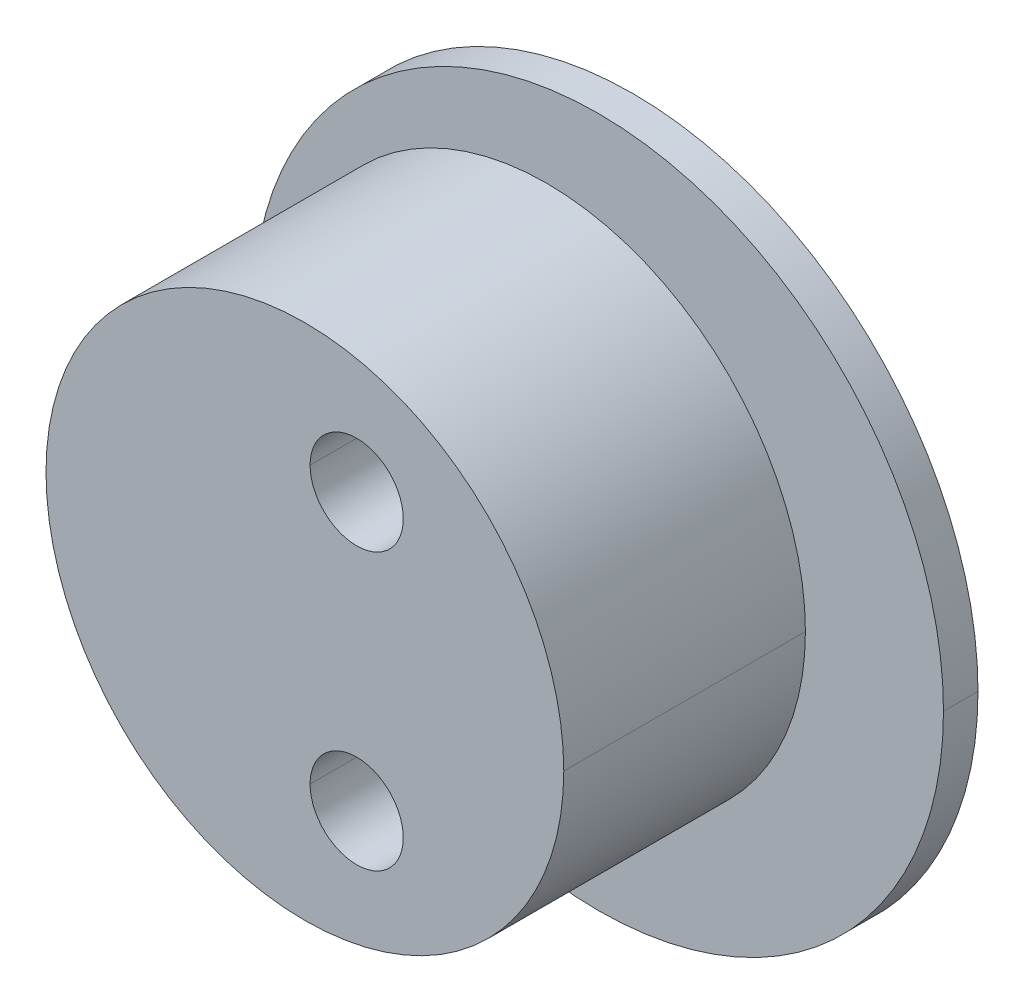
ISO-10303-21;
HEADER;
FILE_DESCRIPTION(('STEP AP214'),'2;1');
FILE_NAME('part.step','',(''),(''),'','','');
FILE_SCHEMA(('AUTOMOTIVE_DESIGN { 1 0 10303 214 1 1 1 1 }'));
ENDSEC;
DATA;
#1=APPLICATION_CONTEXT('core data for automotive mechanical design processes');
#2=APPLICATION_PROTOCOL_DEFINITION('international standard','automotive_design',2000,#1);
#3=PRODUCT_CONTEXT('',#1,'mechanical');
#4=PRODUCT('Part','Part','',(#3));
#5=PRODUCT_RELATED_PRODUCT_CATEGORY('part','',(#4));
#6=PRODUCT_DEFINITION_FORMATION('','',#4);
#7=PRODUCT_DEFINITION_CONTEXT('part definition',#1,'design');
#8=PRODUCT_DEFINITION('design','',#6,#7);
#9=PRODUCT_DEFINITION_SHAPE('','',#8);
#10=(LENGTH_UNIT() NAMED_UNIT(*) SI_UNIT(.MILLI.,.METRE.));
#11=(NAMED_UNIT(*) PLANE_ANGLE_UNIT() SI_UNIT($,.RADIAN.));
#12=(NAMED_UNIT(*) SI_UNIT($,.STERADIAN.) SOLID_ANGLE_UNIT());
#13=UNCERTAINTY_MEASURE_WITH_UNIT(LENGTH_MEASURE(1.E-05),#10,'distance_accuracy_value','');
#14=(GEOMETRIC_REPRESENTATION_CONTEXT(3) GLOBAL_UNCERTAINTY_ASSIGNED_CONTEXT((#13)) GLOBAL_UNIT_ASSIGNED_CONTEXT((#10,
#11,#12)) REPRESENTATION_CONTEXT('',''));
#15=CARTESIAN_POINT('',(0.,0.,0.));
#16=DIRECTION('',(0.,0.,1.));
#17=DIRECTION('',(1.,0.,0.));
#18=AXIS2_PLACEMENT_3D('',#15,#16,#17);
#19=CARTESIAN_POINT('',(0.,4.,0.));
#20=DIRECTION('',(0.,0.,1.));
#21=DIRECTION('',(1.,0.,0.));
#22=AXIS2_PLACEMENT_3D('',#19,#20,#21);
#23=CYLINDRICAL_SURFACE('',#22,1.35);
#24=DIRECTION('',(0.,0.,1.));
#25=VECTOR('',#24,1.);
#26=CARTESIAN_POINT('',(-1.35,4.,0.));
#27=LINE('',#26,#25);
#28=CARTESIAN_POINT('',(-1.35,4.,0.));
#29=VERTEX_POINT('',#28);
#30=CARTESIAN_POINT('',(-1.35,4.,8.));
#31=VERTEX_POINT('',#30);
#32=EDGE_CURVE('E212',#29,#31,#27,.T.);
#33=ORIENTED_EDGE('',*,*,#32,.F.);
#34=CARTESIAN_POINT('',(0.,4.,0.));
#35=DIRECTION('',(0.,0.,1.));
#36=DIRECTION('',(1.,0.,0.));
#37=AXIS2_PLACEMENT_3D('',#34,#35,#36);
#38=CIRCLE('',#37,1.35);
#39=CARTESIAN_POINT('',(1.35,4.,0.));
#40=VERTEX_POINT('',#39);
#41=EDGE_CURVE('E109',#40,#29,#38,.T.);
#42=ORIENTED_EDGE('',*,*,#41,.F.);
#43=DIRECTION('',(0.,0.,1.));
#44=VECTOR('',#43,1.);
#45=CARTESIAN_POINT('',(1.35,4.,0.));
#46=LINE('',#45,#44);
#47=CARTESIAN_POINT('',(1.35,4.,8.));
#48=VERTEX_POINT('',#47);
#49=EDGE_CURVE('E177',#40,#48,#46,.T.);
#50=ORIENTED_EDGE('',*,*,#49,.T.);
#51=CARTESIAN_POINT('',(0.,4.,8.));
#52=DIRECTION('',(0.,0.,1.));
#53=DIRECTION('',(1.,0.,0.));
#54=AXIS2_PLACEMENT_3D('',#51,#52,#53);
#55=CIRCLE('',#54,1.35);
#56=EDGE_CURVE('E20',#48,#31,#55,.T.);
#57=ORIENTED_EDGE('',*,*,#56,.T.);
#58=EDGE_LOOP('',(#33,#42,#50,#57));
#59=FACE_BOUND('',#58,.T.);
#60=ADVANCED_FACE('F17',(#59),#23,.F.);
#61=CARTESIAN_POINT('',(0.,-4.,0.));
#62=DIRECTION('',(0.,0.,1.));
#63=DIRECTION('',(1.,0.,0.));
#64=AXIS2_PLACEMENT_3D('',#61,#62,#63);
#65=CYLINDRICAL_SURFACE('',#64,1.35);
#66=DIRECTION('',(0.,0.,1.));
#67=VECTOR('',#66,1.);
#68=CARTESIAN_POINT('',(-1.35,-4.,0.));
#69=LINE('',#68,#67);
#70=CARTESIAN_POINT('',(-1.35,-4.,0.));
#71=VERTEX_POINT('',#70);
#72=CARTESIAN_POINT('',(-1.35,-4.,8.));
#73=VERTEX_POINT('',#72);
#74=EDGE_CURVE('E166',#71,#73,#69,.T.);
#75=ORIENTED_EDGE('',*,*,#74,.F.);
#76=CARTESIAN_POINT('',(0.,-4.,0.));
#77=DIRECTION('',(0.,0.,1.));
#78=DIRECTION('',(1.,0.,0.));
#79=AXIS2_PLACEMENT_3D('',#76,#77,#78);
#80=CIRCLE('',#79,1.35);
#81=CARTESIAN_POINT('',(1.35,-4.,0.));
#82=VERTEX_POINT('',#81);
#83=EDGE_CURVE('E145',#82,#71,#80,.T.);
#84=ORIENTED_EDGE('',*,*,#83,.F.);
#85=DIRECTION('',(0.,0.,1.));
#86=VECTOR('',#85,1.);
#87=CARTESIAN_POINT('',(1.35,-4.,0.));
#88=LINE('',#87,#86);
#89=CARTESIAN_POINT('',(1.35,-4.,8.));
#90=VERTEX_POINT('',#89);
#91=EDGE_CURVE('E175',#82,#90,#88,.T.);
#92=ORIENTED_EDGE('',*,*,#91,.T.);
#93=CARTESIAN_POINT('',(0.,-4.,8.));
#94=DIRECTION('',(0.,0.,1.));
#95=DIRECTION('',(1.,0.,0.));
#96=AXIS2_PLACEMENT_3D('',#93,#94,#95);
#97=CIRCLE('',#96,1.35);
#98=EDGE_CURVE('E11',#90,#73,#97,.T.);
#99=ORIENTED_EDGE('',*,*,#98,.T.);
#100=EDGE_LOOP('',(#75,#84,#92,#99));
#101=FACE_BOUND('',#100,.T.);
#102=ADVANCED_FACE('F167',(#101),#65,.F.);
#103=CARTESIAN_POINT('',(-1.5,0.,8.));
#104=DIRECTION('',(0.,0.,1.));
#105=DIRECTION('',(1.,0.,0.));
#106=AXIS2_PLACEMENT_3D('',#103,#104,#105);
#107=PLANE('',#106);
#108=ORIENTED_EDGE('',*,*,#98,.F.);
#109=CARTESIAN_POINT('',(0.,-4.,8.));
#110=DIRECTION('',(0.,0.,1.));
#111=DIRECTION('',(1.,0.,0.));
#112=AXIS2_PLACEMENT_3D('',#109,#110,#111);
#113=CIRCLE('',#112,1.35);
#114=EDGE_CURVE('E172',#73,#90,#113,.T.);
#115=ORIENTED_EDGE('',*,*,#114,.F.);
#116=EDGE_LOOP('',(#108,#115));
#117=FACE_BOUND('',#116,.T.);
#118=ORIENTED_EDGE('',*,*,#56,.F.);
#119=CARTESIAN_POINT('',(0.,4.,8.));
#120=DIRECTION('',(0.,0.,1.));
#121=DIRECTION('',(1.,0.,0.));
#122=AXIS2_PLACEMENT_3D('',#119,#120,#121);
#123=CIRCLE('',#122,1.35);
#124=EDGE_CURVE('E183',#31,#48,#123,.T.);
#125=ORIENTED_EDGE('',*,*,#124,.F.);
#126=EDGE_LOOP('',(#118,#125));
#127=FACE_BOUND('',#126,.T.);
#128=CARTESIAN_POINT('',(-1.5,0.,8.));
#129=DIRECTION('',(0.,0.,1.));
#130=DIRECTION('',(1.,0.,0.));
#131=AXIS2_PLACEMENT_3D('',#128,#129,#130);
#132=CIRCLE('',#131,7.5);
#133=CARTESIAN_POINT('',(-9.,0.,8.));
#134=VERTEX_POINT('',#133);
#135=CARTESIAN_POINT('',(6.,0.,8.));
#136=VERTEX_POINT('',#135);
#137=EDGE_CURVE('E114',#134,#136,#132,.T.);
#138=ORIENTED_EDGE('',*,*,#137,.T.);
#139=CARTESIAN_POINT('',(-1.5,0.,8.));
#140=DIRECTION('',(0.,0.,1.));
#141=DIRECTION('',(1.,0.,0.));
#142=AXIS2_PLACEMENT_3D('',#139,#140,#141);
#143=CIRCLE('',#142,7.5);
#144=EDGE_CURVE('E130',#136,#134,#143,.T.);
#145=ORIENTED_EDGE('',*,*,#144,.T.);
#146=EDGE_LOOP('',(#138,#145));
#147=FACE_BOUND('',#146,.T.);
#148=ADVANCED_FACE('F194',(#117,#127,#147),#107,.T.);
#149=CARTESIAN_POINT('',(-1.5,0.,8.));
#150=DIRECTION('',(0.,0.,-1.));
#151=DIRECTION('',(-1.,0.,0.));
#152=AXIS2_PLACEMENT_3D('',#149,#150,#151);
#153=CYLINDRICAL_SURFACE('',#152,7.5);
#154=DIRECTION('',(0.,0.,-1.));
#155=VECTOR('',#154,1.);
#156=CARTESIAN_POINT('',(6.,0.,8.));
#157=LINE('',#156,#155);
#158=CARTESIAN_POINT('',(6.,0.,1.));
#159=VERTEX_POINT('',#158);
#160=EDGE_CURVE('E122',#136,#159,#157,.T.);
#161=ORIENTED_EDGE('',*,*,#160,.F.);
#162=ORIENTED_EDGE('',*,*,#137,.F.);
#163=DIRECTION('',(0.,0.,-1.));
#164=VECTOR('',#163,1.);
#165=CARTESIAN_POINT('',(-9.,0.,8.));
#166=LINE('',#165,#164);
#167=CARTESIAN_POINT('',(-9.,0.,1.));
#168=VERTEX_POINT('',#167);
#169=EDGE_CURVE('E112',#134,#168,#166,.T.);
#170=ORIENTED_EDGE('',*,*,#169,.T.);
#171=CARTESIAN_POINT('',(-1.5,0.,1.));
#172=DIRECTION('',(0.,0.,1.));
#173=DIRECTION('',(1.,0.,0.));
#174=AXIS2_PLACEMENT_3D('',#171,#172,#173);
#175=CIRCLE('',#174,7.5);
#176=EDGE_CURVE('E99',#168,#159,#175,.T.);
#177=ORIENTED_EDGE('',*,*,#176,.T.);
#178=EDGE_LOOP('',(#161,#162,#170,#177));
#179=FACE_BOUND('',#178,.T.);
#180=ADVANCED_FACE('F113',(#179),#153,.T.);
#181=CARTESIAN_POINT('',(0.,0.,0.));
#182=DIRECTION('',(0.,0.,1.));
#183=DIRECTION('',(1.,0.,0.));
#184=AXIS2_PLACEMENT_3D('',#181,#182,#183);
#185=PLANE('',#184);
#186=ORIENTED_EDGE('',*,*,#83,.T.);
#187=CARTESIAN_POINT('',(0.,-4.,0.));
#188=DIRECTION('',(0.,0.,1.));
#189=DIRECTION('',(1.,0.,0.));
#190=AXIS2_PLACEMENT_3D('',#187,#188,#189);
#191=CIRCLE('',#190,1.35);
#192=EDGE_CURVE('E161',#71,#82,#191,.T.);
#193=ORIENTED_EDGE('',*,*,#192,.T.);
#194=EDGE_LOOP('',(#186,#193));
#195=FACE_BOUND('',#194,.T.);
#196=ORIENTED_EDGE('',*,*,#41,.T.);
#197=CARTESIAN_POINT('',(0.,4.,0.));
#198=DIRECTION('',(0.,0.,1.));
#199=DIRECTION('',(1.,0.,0.));
#200=AXIS2_PLACEMENT_3D('',#197,#198,#199);
#201=CIRCLE('',#200,1.35);
#202=EDGE_CURVE('E219',#29,#40,#201,.T.);
#203=ORIENTED_EDGE('',*,*,#202,.T.);
#204=EDGE_LOOP('',(#196,#203));
#205=FACE_BOUND('',#204,.T.);
#206=CARTESIAN_POINT('',(0.,0.,0.));
#207=DIRECTION('',(0.,0.,1.));
#208=DIRECTION('',(1.,0.,0.));
#209=AXIS2_PLACEMENT_3D('',#206,#207,#208);
#210=CIRCLE('',#209,10.);
#211=CARTESIAN_POINT('',(-10.,0.,0.));
#212=VERTEX_POINT('',#211);
#213=CARTESIAN_POINT('',(10.,0.,0.));
#214=VERTEX_POINT('',#213);
#215=EDGE_CURVE('E39',#212,#214,#210,.T.);
#216=ORIENTED_EDGE('',*,*,#215,.F.);
#217=CARTESIAN_POINT('',(0.,0.,0.));
#218=DIRECTION('',(0.,0.,1.));
#219=DIRECTION('',(1.,0.,0.));
#220=AXIS2_PLACEMENT_3D('',#217,#218,#219);
#221=CIRCLE('',#220,10.);
#222=EDGE_CURVE('E135',#214,#212,#221,.T.);
#223=ORIENTED_EDGE('',*,*,#222,.F.);
#224=EDGE_LOOP('',(#216,#223));
#225=FACE_BOUND('',#224,.T.);
#226=ADVANCED_FACE('F158',(#195,#205,#225),#185,.F.);
#227=CARTESIAN_POINT('',(0.,0.,1.));
#228=DIRECTION('',(0.,0.,1.));
#229=DIRECTION('',(1.,0.,0.));
#230=AXIS2_PLACEMENT_3D('',#227,#228,#229);
#231=PLANE('',#230);
#232=ORIENTED_EDGE('',*,*,#176,.F.);
#233=CARTESIAN_POINT('',(-1.5,0.,1.));
#234=DIRECTION('',(0.,0.,1.));
#235=DIRECTION('',(1.,0.,0.));
#236=AXIS2_PLACEMENT_3D('',#233,#234,#235);
#237=CIRCLE('',#236,7.5);
#238=EDGE_CURVE('E104',#159,#168,#237,.T.);
#239=ORIENTED_EDGE('',*,*,#238,.F.);
#240=EDGE_LOOP('',(#232,#239));
#241=FACE_BOUND('',#240,.T.);
#242=CARTESIAN_POINT('',(0.,0.,1.));
#243=DIRECTION('',(0.,0.,1.));
#244=DIRECTION('',(1.,0.,0.));
#245=AXIS2_PLACEMENT_3D('',#242,#243,#244);
#246=CIRCLE('',#245,10.);
#247=CARTESIAN_POINT('',(-10.,0.,1.));
#248=VERTEX_POINT('',#247);
#249=CARTESIAN_POINT('',(10.,0.,1.));
#250=VERTEX_POINT('',#249);
#251=EDGE_CURVE('E142',#248,#250,#246,.T.);
#252=ORIENTED_EDGE('',*,*,#251,.T.);
#253=CARTESIAN_POINT('',(0.,0.,1.));
#254=DIRECTION('',(0.,0.,1.));
#255=DIRECTION('',(1.,0.,0.));
#256=AXIS2_PLACEMENT_3D('',#253,#254,#255);
#257=CIRCLE('',#256,10.);
#258=EDGE_CURVE('E119',#250,#248,#257,.T.);
#259=ORIENTED_EDGE('',*,*,#258,.T.);
#260=EDGE_LOOP('',(#252,#259));
#261=FACE_BOUND('',#260,.T.);
#262=ADVANCED_FACE('F101',(#241,#261),#231,.T.);
#263=CARTESIAN_POINT('',(0.,0.,1.));
#264=DIRECTION('',(0.,0.,-1.));
#265=DIRECTION('',(-1.,0.,0.));
#266=AXIS2_PLACEMENT_3D('',#263,#264,#265);
#267=CYLINDRICAL_SURFACE('',#266,10.);
#268=DIRECTION('',(0.,0.,-1.));
#269=VECTOR('',#268,1.);
#270=CARTESIAN_POINT('',(10.,0.,1.));
#271=LINE('',#270,#269);
#272=EDGE_CURVE('E139',#250,#214,#271,.T.);
#273=ORIENTED_EDGE('',*,*,#272,.F.);
#274=ORIENTED_EDGE('',*,*,#251,.F.);
#275=DIRECTION('',(0.,0.,-1.));
#276=VECTOR('',#275,1.);
#277=CARTESIAN_POINT('',(-10.,0.,1.));
#278=LINE('',#277,#276);
#279=EDGE_CURVE('E138',#248,#212,#278,.T.);
#280=ORIENTED_EDGE('',*,*,#279,.T.);
#281=ORIENTED_EDGE('',*,*,#215,.T.);
#282=EDGE_LOOP('',(#273,#274,#280,#281));
#283=FACE_BOUND('',#282,.T.);
#284=ADVANCED_FACE('F283',(#283),#267,.T.);
#285=CARTESIAN_POINT('',(0.,0.,1.));
#286=DIRECTION('',(0.,0.,-1.));
#287=DIRECTION('',(-1.,0.,0.));
#288=AXIS2_PLACEMENT_3D('',#285,#286,#287);
#289=CYLINDRICAL_SURFACE('',#288,10.);
#290=ORIENTED_EDGE('',*,*,#258,.F.);
#291=ORIENTED_EDGE('',*,*,#272,.T.);
#292=ORIENTED_EDGE('',*,*,#222,.T.);
#293=ORIENTED_EDGE('',*,*,#279,.F.);
#294=EDGE_LOOP('',(#290,#291,#292,#293));
#295=FACE_BOUND('',#294,.T.);
#296=ADVANCED_FACE('F278',(#295),#289,.T.);
#297=CARTESIAN_POINT('',(-1.5,0.,8.));
#298=DIRECTION('',(0.,0.,-1.));
#299=DIRECTION('',(-1.,0.,0.));
#300=AXIS2_PLACEMENT_3D('',#297,#298,#299);
#301=CYLINDRICAL_SURFACE('',#300,7.5);
#302=ORIENTED_EDGE('',*,*,#144,.F.);
#303=ORIENTED_EDGE('',*,*,#160,.T.);
#304=ORIENTED_EDGE('',*,*,#238,.T.);
#305=ORIENTED_EDGE('',*,*,#169,.F.);
#306=EDGE_LOOP('',(#302,#303,#304,#305));
#307=FACE_BOUND('',#306,.T.);
#308=ADVANCED_FACE('F121',(#307),#301,.T.);
#309=CARTESIAN_POINT('',(0.,-4.,0.));
#310=DIRECTION('',(0.,0.,1.));
#311=DIRECTION('',(1.,0.,0.));
#312=AXIS2_PLACEMENT_3D('',#309,#310,#311);
#313=CYLINDRICAL_SURFACE('',#312,1.35);
#314=ORIENTED_EDGE('',*,*,#192,.F.);
#315=ORIENTED_EDGE('',*,*,#74,.T.);
#316=ORIENTED_EDGE('',*,*,#114,.T.);
#317=ORIENTED_EDGE('',*,*,#91,.F.);
#318=EDGE_LOOP('',(#314,#315,#316,#317));
#319=FACE_BOUND('',#318,.T.);
#320=ADVANCED_FACE('F174',(#319),#313,.F.);
#321=CARTESIAN_POINT('',(0.,4.,0.));
#322=DIRECTION('',(0.,0.,1.));
#323=DIRECTION('',(1.,0.,0.));
#324=AXIS2_PLACEMENT_3D('',#321,#322,#323);
#325=CYLINDRICAL_SURFACE('',#324,1.35);
#326=ORIENTED_EDGE('',*,*,#202,.F.);
#327=ORIENTED_EDGE('',*,*,#32,.T.);
#328=ORIENTED_EDGE('',*,*,#124,.T.);
#329=ORIENTED_EDGE('',*,*,#49,.F.);
#330=EDGE_LOOP('',(#326,#327,#328,#329));
#331=FACE_BOUND('',#330,.T.);
#332=ADVANCED_FACE('F222',(#331),#325,.F.);
#333=CLOSED_SHELL('',(#60,#102,#148,#180,#226,#262,#284,#296,#308,#320,#332));
#334=MANIFOLD_SOLID_BREP('B1',#333);
#335=ADVANCED_BREP_SHAPE_REPRESENTATION('',(#18,#334),#14);
#336=SHAPE_DEFINITION_REPRESENTATION(#9,#335);
ENDSEC;
END-ISO-10303-21;
